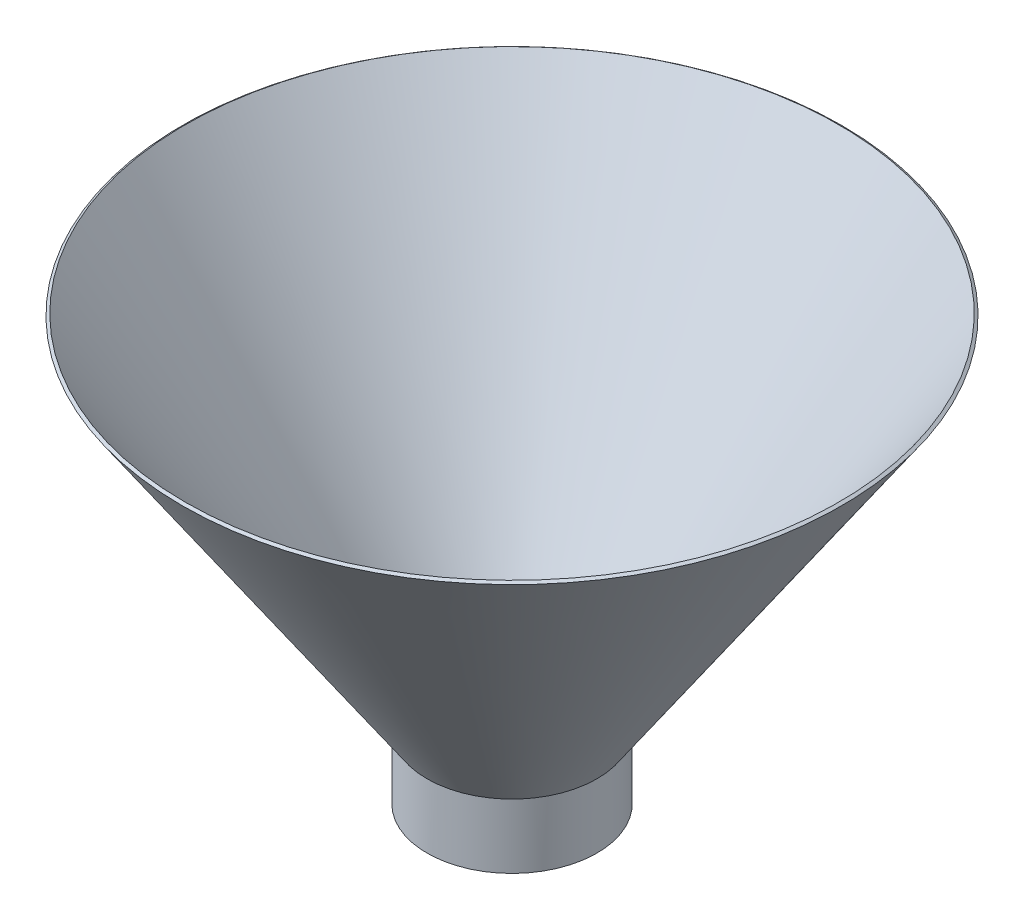
ISO-10303-21;
HEADER;
FILE_DESCRIPTION(('STEP AP214'),'2;1');
FILE_NAME('part.step','',(''),(''),'','','');
FILE_SCHEMA(('AUTOMOTIVE_DESIGN { 1 0 10303 214 1 1 1 1 }'));
ENDSEC;
DATA;
#1=APPLICATION_CONTEXT('core data for automotive mechanical design processes');
#2=APPLICATION_PROTOCOL_DEFINITION('international standard','automotive_design',2000,#1);
#3=PRODUCT_CONTEXT('',#1,'mechanical');
#4=PRODUCT('Part','Part','',(#3));
#5=PRODUCT_RELATED_PRODUCT_CATEGORY('part','',(#4));
#6=PRODUCT_DEFINITION_FORMATION('','',#4);
#7=PRODUCT_DEFINITION_CONTEXT('part definition',#1,'design');
#8=PRODUCT_DEFINITION('design','',#6,#7);
#9=PRODUCT_DEFINITION_SHAPE('','',#8);
#10=(LENGTH_UNIT() NAMED_UNIT(*) SI_UNIT(.MILLI.,.METRE.));
#11=(NAMED_UNIT(*) PLANE_ANGLE_UNIT() SI_UNIT($,.RADIAN.));
#12=(NAMED_UNIT(*) SI_UNIT($,.STERADIAN.) SOLID_ANGLE_UNIT());
#13=UNCERTAINTY_MEASURE_WITH_UNIT(LENGTH_MEASURE(1.E-05),#10,'distance_accuracy_value','');
#14=(GEOMETRIC_REPRESENTATION_CONTEXT(3) GLOBAL_UNCERTAINTY_ASSIGNED_CONTEXT((#13)) GLOBAL_UNIT_ASSIGNED_CONTEXT((#10,
#11,#12)) REPRESENTATION_CONTEXT('',''));
#15=CARTESIAN_POINT('',(0.,0.,0.));
#16=DIRECTION('',(0.,0.,1.));
#17=DIRECTION('',(1.,0.,0.));
#18=AXIS2_PLACEMENT_3D('',#15,#16,#17);
#19=CARTESIAN_POINT('',(0.,0.,0.));
#20=DIRECTION('',(0.,1.,0.));
#21=DIRECTION('',(0.,0.,1.));
#22=AXIS2_PLACEMENT_3D('',#19,#20,#21);
#23=PLANE('',#22);
#24=CARTESIAN_POINT('',(0.,0.,0.));
#25=DIRECTION('',(0.,-1.,0.));
#26=DIRECTION('',(0.,0.,-1.));
#27=AXIS2_PLACEMENT_3D('',#24,#25,#26);
#28=CIRCLE('',#27,50.);
#29=CARTESIAN_POINT('',(0.,0.,-50.));
#30=VERTEX_POINT('',#29);
#31=EDGE_CURVE('E47',#30,#30,#28,.T.);
#32=ORIENTED_EDGE('',*,*,#31,.F.);
#33=EDGE_LOOP('',(#32));
#34=FACE_BOUND('',#33,.T.);
#35=CARTESIAN_POINT('',(0.,0.,0.));
#36=DIRECTION('',(0.,-1.,0.));
#37=DIRECTION('',(0.,0.,-1.));
#38=AXIS2_PLACEMENT_3D('',#35,#36,#37);
#39=CIRCLE('',#38,52.);
#40=CARTESIAN_POINT('',(0.,0.,-52.));
#41=VERTEX_POINT('',#40);
#42=EDGE_CURVE('E42',#41,#41,#39,.T.);
#43=ORIENTED_EDGE('',*,*,#42,.T.);
#44=EDGE_LOOP('',(#43));
#45=FACE_BOUND('',#44,.T.);
#46=ADVANCED_FACE('F39',(#34,#45),#23,.F.);
#47=CARTESIAN_POINT('',(0.,260.,0.));
#48=DIRECTION('',(0.,-1.,0.));
#49=DIRECTION('',(0.,0.,-1.));
#50=AXIS2_PLACEMENT_3D('',#47,#48,#49);
#51=CONICAL_SURFACE('',#50,200.,0.972377433316359);
#52=CARTESIAN_POINT('',(0.,260.,0.));
#53=DIRECTION('',(0.,-1.,0.));
#54=DIRECTION('',(0.,0.,-1.));
#55=AXIS2_PLACEMENT_3D('',#52,#53,#54);
#56=CIRCLE('',#55,200.);
#57=CARTESIAN_POINT('',(0.,260.,200.));
#58=VERTEX_POINT('',#57);
#59=EDGE_CURVE('E10',#58,#58,#56,.T.);
#60=ORIENTED_EDGE('',*,*,#59,.T.);
#61=EDGE_LOOP('',(#60));
#62=FACE_BOUND('',#61,.T.);
#63=CARTESIAN_POINT('',(0.,258.873326350717,0.));
#64=DIRECTION('',(0.,1.,0.));
#65=DIRECTION('',(0.,0.,1.));
#66=AXIS2_PLACEMENT_3D('',#63,#64,#65);
#67=CIRCLE('',#66,201.652454685615);
#68=CARTESIAN_POINT('',(0.,258.873326350717,201.652454685615));
#69=VERTEX_POINT('',#68);
#70=EDGE_CURVE('E59',#69,#69,#67,.F.);
#71=ORIENTED_EDGE('',*,*,#70,.F.);
#72=EDGE_LOOP('',(#71));
#73=FACE_BOUND('',#72,.T.);
#74=ADVANCED_FACE('F90',(#62,#73),#51,.T.);
#75=CARTESIAN_POINT('',(0.,260.,0.));
#76=DIRECTION('',(0.,1.,0.));
#77=DIRECTION('',(0.,0.,1.));
#78=AXIS2_PLACEMENT_3D('',#75,#76,#77);
#79=CONICAL_SURFACE('',#78,200.,0.598418893478537);
#80=CARTESIAN_POINT('',(0.,40.,0.));
#81=DIRECTION('',(0.,-1.,0.));
#82=DIRECTION('',(0.,0.,-1.));
#83=AXIS2_PLACEMENT_3D('',#80,#81,#82);
#84=CIRCLE('',#83,50.);
#85=CARTESIAN_POINT('',(0.,40.,50.));
#86=VERTEX_POINT('',#85);
#87=EDGE_CURVE('E53',#86,#86,#84,.T.);
#88=CARTESIAN_POINT('',(0.,40.,50.));
#89=CARTESIAN_POINT('',(0.,42.2916666666667,51.5625));
#90=CARTESIAN_POINT('',(0.,44.5833333333334,53.125));
#91=CARTESIAN_POINT('',(0.,49.1666666666667,56.25));
#92=CARTESIAN_POINT('',(0.,51.4583333333334,57.8125));
#93=CARTESIAN_POINT('',(0.,56.0416666666667,60.9375));
#94=CARTESIAN_POINT('',(0.,58.3333333333334,62.5));
#95=CARTESIAN_POINT('',(0.,62.9166666666667,65.625));
#96=CARTESIAN_POINT('',(0.,65.2083333333334,67.1875));
#97=CARTESIAN_POINT('',(0.,69.7916666666667,70.3125));
#98=CARTESIAN_POINT('',(0.,72.0833333333334,71.875));
#99=CARTESIAN_POINT('',(0.,76.6666666666667,75.));
#100=CARTESIAN_POINT('',(0.,78.9583333333334,76.5625));
#101=CARTESIAN_POINT('',(0.,83.5416666666667,79.6875));
#102=CARTESIAN_POINT('',(0.,85.8333333333334,81.25));
#103=CARTESIAN_POINT('',(0.,90.4166666666667,84.375));
#104=CARTESIAN_POINT('',(0.,92.7083333333334,85.9375));
#105=CARTESIAN_POINT('',(0.,97.2916666666667,89.0625));
#106=CARTESIAN_POINT('',(0.,99.5833333333334,90.625));
#107=CARTESIAN_POINT('',(0.,104.166666666667,93.75));
#108=CARTESIAN_POINT('',(0.,106.458333333333,95.3125));
#109=CARTESIAN_POINT('',(0.,111.041666666667,98.4375));
#110=CARTESIAN_POINT('',(0.,113.333333333333,100.));
#111=CARTESIAN_POINT('',(0.,117.916666666667,103.125));
#112=CARTESIAN_POINT('',(0.,120.208333333333,104.6875));
#113=CARTESIAN_POINT('',(0.,124.791666666667,107.8125));
#114=CARTESIAN_POINT('',(0.,127.083333333333,109.375));
#115=CARTESIAN_POINT('',(0.,131.666666666667,112.5));
#116=CARTESIAN_POINT('',(0.,133.958333333333,114.0625));
#117=CARTESIAN_POINT('',(0.,138.541666666667,117.1875));
#118=CARTESIAN_POINT('',(0.,140.833333333333,118.75));
#119=CARTESIAN_POINT('',(0.,145.416666666667,121.875));
#120=CARTESIAN_POINT('',(0.,147.708333333333,123.4375));
#121=CARTESIAN_POINT('',(0.,152.291666666667,126.5625));
#122=CARTESIAN_POINT('',(0.,154.583333333333,128.125));
#123=CARTESIAN_POINT('',(0.,159.166666666667,131.25));
#124=CARTESIAN_POINT('',(0.,161.458333333333,132.8125));
#125=CARTESIAN_POINT('',(0.,166.041666666667,135.9375));
#126=CARTESIAN_POINT('',(0.,168.333333333333,137.5));
#127=CARTESIAN_POINT('',(0.,172.916666666667,140.625));
#128=CARTESIAN_POINT('',(0.,175.208333333333,142.1875));
#129=CARTESIAN_POINT('',(0.,179.791666666667,145.3125));
#130=CARTESIAN_POINT('',(0.,182.083333333333,146.875));
#131=CARTESIAN_POINT('',(0.,186.666666666667,150.));
#132=CARTESIAN_POINT('',(0.,188.958333333333,151.5625));
#133=CARTESIAN_POINT('',(0.,193.541666666667,154.6875));
#134=CARTESIAN_POINT('',(0.,195.833333333333,156.25));
#135=CARTESIAN_POINT('',(0.,200.416666666667,159.375));
#136=CARTESIAN_POINT('',(0.,202.708333333333,160.9375));
#137=CARTESIAN_POINT('',(0.,207.291666666667,164.0625));
#138=CARTESIAN_POINT('',(0.,209.583333333333,165.625));
#139=CARTESIAN_POINT('',(0.,214.166666666667,168.75));
#140=CARTESIAN_POINT('',(0.,216.458333333333,170.3125));
#141=CARTESIAN_POINT('',(0.,221.041666666667,173.4375));
#142=CARTESIAN_POINT('',(0.,223.333333333333,175.));
#143=CARTESIAN_POINT('',(0.,227.916666666667,178.125));
#144=CARTESIAN_POINT('',(0.,230.208333333333,179.6875));
#145=CARTESIAN_POINT('',(0.,234.791666666667,182.8125));
#146=CARTESIAN_POINT('',(0.,237.083333333333,184.375));
#147=CARTESIAN_POINT('',(0.,241.666666666667,187.5));
#148=CARTESIAN_POINT('',(0.,243.958333333333,189.0625));
#149=CARTESIAN_POINT('',(0.,248.541666666667,192.1875));
#150=CARTESIAN_POINT('',(0.,250.833333333333,193.75));
#151=CARTESIAN_POINT('',(0.,255.416666666667,196.875));
#152=CARTESIAN_POINT('',(0.,257.708333333333,198.4375));
#153=CARTESIAN_POINT('',(0.,260.,200.));
#154=B_SPLINE_CURVE_WITH_KNOTS('',3,(#88,#89,#90,#91,#92,#93,#94,#95,#96,#97,#98,#99,#100,#101,
#102,#103,#104,#105,#106,#107,#108,#109,#110,#111,#112,#113,#114,#115,#116,#117,#118,#119,#120,
#121,#122,#123,#124,#125,#126,#127,#128,#129,#130,#131,#132,#133,#134,#135,#136,#137,#138,#139,
#140,#141,#142,#143,#144,#145,#146,#147,#148,#149,#150,#151,#152,#153),.UNSPECIFIED.,.F.,.F.,(4,
2,2,2,2,2,2,2,2,2,2,2,2,2,2,2,2,2,2,2,2,2,2,2,2,2,2,2,2,2,2,2,4),(0.,8.32095434730895,
16.641908694618,24.9628630419269,33.2838173892359,41.6047717365448,49.9257260838538,
58.2466804311628,66.5676347784717,74.8885891257807,83.2095434730897,91.5304978203986,
99.8514521677076,108.172406515017,116.493360862326,124.814315209635,133.135269556943,
141.456223904252,149.777178251561,158.09813259887,166.419086946179,174.740041293488,
183.060995640797,191.381949988106,199.702904335415,208.023858682724,216.344813030033,
224.665767377342,232.986721724651,241.30767607196,249.628630419269,257.949584766578,
266.270539113887),.UNSPECIFIED.);
#155=EDGE_CURVE('BSEAM85',#86,#58,#154,.T.);
#156=ORIENTED_EDGE('',*,*,#87,.T.);
#157=ORIENTED_EDGE('',*,*,#59,.F.);
#158=ORIENTED_EDGE('',*,*,#155,.T.);
#159=ORIENTED_EDGE('',*,*,#155,.F.);
#160=EDGE_LOOP('',(#156,#158,#157,#159));
#161=FACE_BOUND('',#160,.T.);
#162=ADVANCED_FACE('F85',(#161),#79,.F.);
#163=CARTESIAN_POINT('',(0.,324.346324006704,0.));
#164=DIRECTION('',(0.,-1.,0.));
#165=DIRECTION('',(0.,0.,-1.));
#166=AXIS2_PLACEMENT_3D('',#163,#164,#165);
#167=CYLINDRICAL_SURFACE('',#166,50.);
#168=ORIENTED_EDGE('',*,*,#31,.T.);
#169=EDGE_LOOP('',(#168));
#170=FACE_BOUND('',#169,.T.);
#171=ORIENTED_EDGE('',*,*,#87,.F.);
#172=EDGE_LOOP('',(#171));
#173=FACE_BOUND('',#172,.T.);
#174=ADVANCED_FACE('F80',(#170,#173),#167,.F.);
#175=CARTESIAN_POINT('',(0.,258.873326350717,0.));
#176=DIRECTION('',(0.,1.,0.));
#177=DIRECTION('',(0.,0.,1.));
#178=AXIS2_PLACEMENT_3D('',#175,#176,#177);
#179=CONICAL_SURFACE('',#178,201.652454685615,0.598418893478537);
#180=CARTESIAN_POINT('',(0.,39.3830594784816,0.));
#181=DIRECTION('',(0.,1.,0.));
#182=DIRECTION('',(0.,0.,1.));
#183=AXIS2_PLACEMENT_3D('',#180,#181,#182);
#184=CIRCLE('',#183,52.);
#185=CARTESIAN_POINT('',(0.,39.3830594784815,52.));
#186=VERTEX_POINT('',#185);
#187=EDGE_CURVE('E60',#186,#186,#184,.F.);
#188=CARTESIAN_POINT('',(0.,39.3830594784815,52.));
#189=CARTESIAN_POINT('',(0.,41.6694164250673,53.5588797363085));
#190=CARTESIAN_POINT('',(0.,43.9557733716531,55.117759472617));
#191=CARTESIAN_POINT('',(0.,48.5284872648247,58.235518945234));
#192=CARTESIAN_POINT('',(0.,50.8148442114105,59.7943986815425));
#193=CARTESIAN_POINT('',(0.,55.387558104582,62.9121581541594));
#194=CARTESIAN_POINT('',(0.,57.6739150511678,64.4710378904679));
#195=CARTESIAN_POINT('',(0.,62.2466289443394,67.5887973630849));
#196=CARTESIAN_POINT('',(0.,64.5329858909252,69.1476770993934));
#197=CARTESIAN_POINT('',(0.,69.1056997840967,72.2654365720104));
#198=CARTESIAN_POINT('',(0.,71.3920567306825,73.8243163083189));
#199=CARTESIAN_POINT('',(0.,75.9647706238541,76.9420757809359));
#200=CARTESIAN_POINT('',(0.,78.2511275704399,78.5009555172443));
#201=CARTESIAN_POINT('',(0.,82.8238414636114,81.6187149898613));
#202=CARTESIAN_POINT('',(0.,85.1101984101973,83.1775947261698));
#203=CARTESIAN_POINT('',(0.,89.6829123033688,86.2953541987868));
#204=CARTESIAN_POINT('',(0.,91.9692692499546,87.8542339350953));
#205=CARTESIAN_POINT('',(0.,96.5419831431262,90.9719934077123));
#206=CARTESIAN_POINT('',(0.,98.828340089712,92.5308731440208));
#207=CARTESIAN_POINT('',(0.,103.401053982884,95.6486326166378));
#208=CARTESIAN_POINT('',(0.,105.687410929469,97.2075123529462));
#209=CARTESIAN_POINT('',(0.,110.260124822641,100.325271825563));
#210=CARTESIAN_POINT('',(0.,112.546481769227,101.884151561872));
#211=CARTESIAN_POINT('',(0.,117.119195662398,105.001911034489));
#212=CARTESIAN_POINT('',(0.,119.405552608984,106.560790770797));
#213=CARTESIAN_POINT('',(0.,123.978266502156,109.678550243414));
#214=CARTESIAN_POINT('',(0.,126.264623448741,111.237429979723));
#215=CARTESIAN_POINT('',(0.,130.837337341913,114.35518945234));
#216=CARTESIAN_POINT('',(0.,133.123694288499,115.914069188648));
#217=CARTESIAN_POINT('',(0.,137.69640818167,119.031828661265));
#218=CARTESIAN_POINT('',(0.,139.982765128256,120.590708397574));
#219=CARTESIAN_POINT('',(0.,144.555479021428,123.708467870191));
#220=CARTESIAN_POINT('',(0.,146.841835968013,125.267347606499));
#221=CARTESIAN_POINT('',(0.,151.414549861185,128.385107079116));
#222=CARTESIAN_POINT('',(0.,153.700906807771,129.943986815425));
#223=CARTESIAN_POINT('',(0.,158.273620700942,133.061746288042));
#224=CARTESIAN_POINT('',(0.,160.559977647528,134.62062602435));
#225=CARTESIAN_POINT('',(0.,165.1326915407,137.738385496967));
#226=CARTESIAN_POINT('',(0.,167.419048487286,139.297265233275));
#227=CARTESIAN_POINT('',(0.,171.991762380457,142.415024705892));
#228=CARTESIAN_POINT('',(0.,174.278119327043,143.973904442201));
#229=CARTESIAN_POINT('',(0.,178.850833220214,147.091663914818));
#230=CARTESIAN_POINT('',(0.,181.1371901668,148.650543651126));
#231=CARTESIAN_POINT('',(0.,185.709904059972,151.768303123743));
#232=CARTESIAN_POINT('',(0.,187.996261006558,153.327182860052));
#233=CARTESIAN_POINT('',(0.,192.568974899729,156.444942332669));
#234=CARTESIAN_POINT('',(0.,194.855331846315,158.003822068977));
#235=CARTESIAN_POINT('',(0.,199.428045739487,161.121581541594));
#236=CARTESIAN_POINT('',(0.,201.714402686072,162.680461277903));
#237=CARTESIAN_POINT('',(0.,206.287116579244,165.79822075052));
#238=CARTESIAN_POINT('',(0.,208.57347352583,167.357100486828));
#239=CARTESIAN_POINT('',(0.,213.146187419001,170.474859959445));
#240=CARTESIAN_POINT('',(0.,215.432544365587,172.033739695754));
#241=CARTESIAN_POINT('',(0.,220.005258258759,175.151499168371));
#242=CARTESIAN_POINT('',(0.,222.291615205344,176.710378904679));
#243=CARTESIAN_POINT('',(0.,226.864329098516,179.828138377296));
#244=CARTESIAN_POINT('',(0.,229.150686045102,181.387018113605));
#245=CARTESIAN_POINT('',(0.,233.723399938273,184.504777586222));
#246=CARTESIAN_POINT('',(0.,236.009756884859,186.06365732253));
#247=CARTESIAN_POINT('',(0.,240.582470778031,189.181416795147));
#248=CARTESIAN_POINT('',(0.,242.868827724616,190.740296531456));
#249=CARTESIAN_POINT('',(0.,247.441541617788,193.858056004073));
#250=CARTESIAN_POINT('',(0.,249.727898564374,195.416935740381));
#251=CARTESIAN_POINT('',(0.,254.300612457545,198.534695212998));
#252=CARTESIAN_POINT('',(0.,256.586969404131,200.093574949307));
#253=CARTESIAN_POINT('',(0.,258.873326350717,201.652454685615));
#254=B_SPLINE_CURVE_WITH_KNOTS('',3,(#188,#189,#190,#191,#192,#193,#194,#195,#196,#197,#198,
#199,#200,#201,#202,#203,#204,#205,#206,#207,#208,#209,#210,#211,#212,#213,#214,#215,#216,#217,
#218,#219,#220,#221,#222,#223,#224,#225,#226,#227,#228,#229,#230,#231,#232,#233,#234,#235,#236,
#237,#238,#239,#240,#241,#242,#243,#244,#245,#246,#247,#248,#249,#250,#251,#252,#253),
.UNSPECIFIED.,.F.,.F.,(4,2,2,2,2,2,2,2,2,2,2,2,2,2,2,2,2,2,2,2,2,2,2,2,2,2,2,2,2,2,2,2,4),(0.,
8.30167495601152,16.603349912023,24.9050248680345,33.206699824046,41.5083747800576,
49.8100497360691,58.1117246920806,66.4133996480921,74.7150746041036,83.0167495601151,
91.3184245161266,99.6200994721381,107.92177442815,116.223449384161,124.525124340173,
132.826799296184,141.128474252196,149.430149208207,157.731824164219,166.03349912023,
174.335174076242,182.636849032253,190.938523988265,199.240198944276,207.541873900288,
215.843548856299,224.145223812311,232.446898768322,240.748573724334,249.050248680345,
257.351923636357,265.653598592368),.UNSPECIFIED.);
#255=EDGE_CURVE('BSEAM75',#186,#69,#254,.T.);
#256=ORIENTED_EDGE('',*,*,#187,.F.);
#257=ORIENTED_EDGE('',*,*,#70,.T.);
#258=ORIENTED_EDGE('',*,*,#255,.T.);
#259=ORIENTED_EDGE('',*,*,#255,.F.);
#260=EDGE_LOOP('',(#256,#258,#257,#259));
#261=FACE_BOUND('',#260,.T.);
#262=ADVANCED_FACE('F75',(#261),#179,.T.);
#263=CARTESIAN_POINT('',(0.,324.346324006704,0.));
#264=DIRECTION('',(0.,-1.,0.));
#265=DIRECTION('',(0.,0.,-1.));
#266=AXIS2_PLACEMENT_3D('',#263,#264,#265);
#267=CYLINDRICAL_SURFACE('',#266,52.);
#268=ORIENTED_EDGE('',*,*,#42,.F.);
#269=EDGE_LOOP('',(#268));
#270=FACE_BOUND('',#269,.T.);
#271=ORIENTED_EDGE('',*,*,#187,.T.);
#272=EDGE_LOOP('',(#271));
#273=FACE_BOUND('',#272,.T.);
#274=ADVANCED_FACE('F72',(#270,#273),#267,.T.);
#275=CLOSED_SHELL('',(#46,#74,#162,#174,#262,#274));
#276=MANIFOLD_SOLID_BREP('B2',#275);
#277=ADVANCED_BREP_SHAPE_REPRESENTATION('',(#18,#276),#14);
#278=SHAPE_DEFINITION_REPRESENTATION(#9,#277);
ENDSEC;
END-ISO-10303-21;
